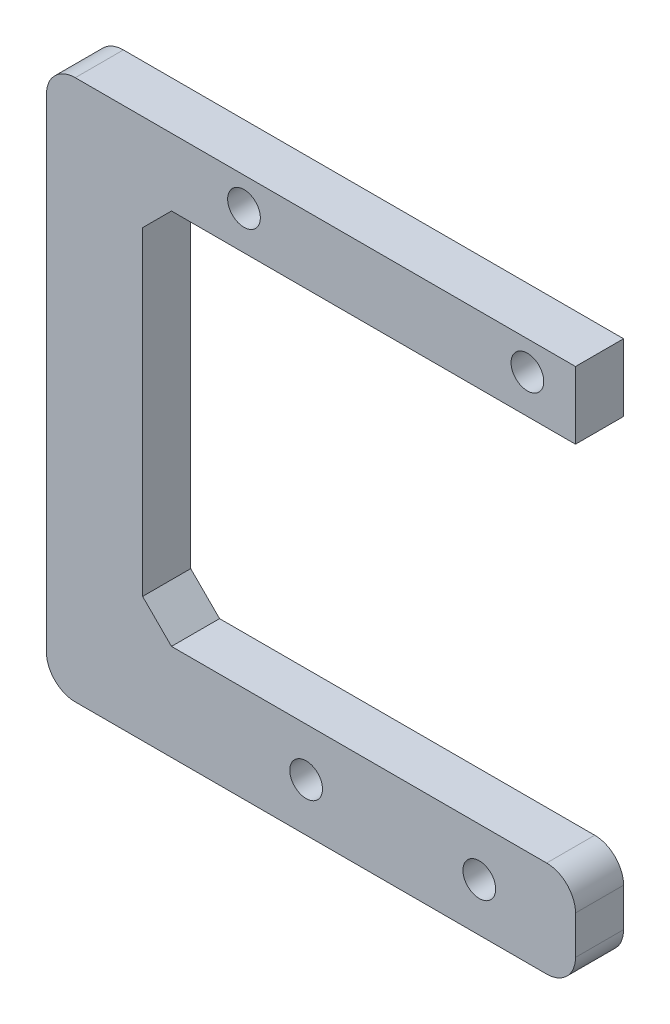
ISO-10303-21;
HEADER;
FILE_DESCRIPTION(('STEP AP214'),'2;1');
FILE_NAME('part.step','',(''),(''),'','','');
FILE_SCHEMA(('AUTOMOTIVE_DESIGN { 1 0 10303 214 1 1 1 1 }'));
ENDSEC;
DATA;
#1=APPLICATION_CONTEXT('core data for automotive mechanical design processes');
#2=APPLICATION_PROTOCOL_DEFINITION('international standard','automotive_design',2000,#1);
#3=PRODUCT_CONTEXT('',#1,'mechanical');
#4=PRODUCT('Part','Part','',(#3));
#5=PRODUCT_RELATED_PRODUCT_CATEGORY('part','',(#4));
#6=PRODUCT_DEFINITION_FORMATION('','',#4);
#7=PRODUCT_DEFINITION_CONTEXT('part definition',#1,'design');
#8=PRODUCT_DEFINITION('design','',#6,#7);
#9=PRODUCT_DEFINITION_SHAPE('','',#8);
#10=(LENGTH_UNIT() NAMED_UNIT(*) SI_UNIT(.MILLI.,.METRE.));
#11=(NAMED_UNIT(*) PLANE_ANGLE_UNIT() SI_UNIT($,.RADIAN.));
#12=(NAMED_UNIT(*) SI_UNIT($,.STERADIAN.) SOLID_ANGLE_UNIT());
#13=UNCERTAINTY_MEASURE_WITH_UNIT(LENGTH_MEASURE(1.E-05),#10,'distance_accuracy_value','');
#14=(GEOMETRIC_REPRESENTATION_CONTEXT(3) GLOBAL_UNCERTAINTY_ASSIGNED_CONTEXT((#13)) GLOBAL_UNIT_ASSIGNED_CONTEXT((#10,
#11,#12)) REPRESENTATION_CONTEXT('',''));
#15=CARTESIAN_POINT('',(0.,0.,0.));
#16=DIRECTION('',(0.,0.,1.));
#17=DIRECTION('',(1.,0.,0.));
#18=AXIS2_PLACEMENT_3D('',#15,#16,#17);
#19=CARTESIAN_POINT('',(0.,0.,5.));
#20=DIRECTION('',(0.,0.,-1.));
#21=DIRECTION('',(-1.,0.,0.));
#22=AXIS2_PLACEMENT_3D('',#19,#20,#21);
#23=PLANE('',#22);
#24=DIRECTION('',(-1.,0.,0.));
#25=VECTOR('',#24,1.);
#26=CARTESIAN_POINT('',(-55.,56.2,5.));
#27=LINE('',#26,#25);
#28=CARTESIAN_POINT('',(0.,56.2,5.));
#29=VERTEX_POINT('',#28);
#30=CARTESIAN_POINT('',(-52.,56.2,5.));
#31=VERTEX_POINT('',#30);
#32=EDGE_CURVE('E158',#29,#31,#27,.T.);
#33=ORIENTED_EDGE('',*,*,#32,.T.);
#34=CARTESIAN_POINT('',(-52.,53.2,5.));
#35=DIRECTION('',(0.,0.,-1.));
#36=DIRECTION('',(-1.,0.,0.));
#37=AXIS2_PLACEMENT_3D('',#34,#35,#36);
#38=CIRCLE('',#37,3.);
#39=CARTESIAN_POINT('',(-55.,53.2,5.));
#40=VERTEX_POINT('',#39);
#41=EDGE_CURVE('E213',#31,#40,#38,.F.);
#42=ORIENTED_EDGE('',*,*,#41,.T.);
#43=DIRECTION('',(0.,-1.,0.));
#44=VECTOR('',#43,1.);
#45=CARTESIAN_POINT('',(-55.,0.,5.));
#46=LINE('',#45,#44);
#47=CARTESIAN_POINT('',(-55.,2.99999999999999,5.));
#48=VERTEX_POINT('',#47);
#49=EDGE_CURVE('E160',#40,#48,#46,.T.);
#50=ORIENTED_EDGE('',*,*,#49,.T.);
#51=CARTESIAN_POINT('',(-52.,2.99999999999999,5.));
#52=DIRECTION('',(0.,0.,-1.));
#53=DIRECTION('',(-1.,0.,0.));
#54=AXIS2_PLACEMENT_3D('',#51,#52,#53);
#55=CIRCLE('',#54,3.);
#56=CARTESIAN_POINT('',(-52.,0.,5.));
#57=VERTEX_POINT('',#56);
#58=EDGE_CURVE('E211',#48,#57,#55,.F.);
#59=ORIENTED_EDGE('',*,*,#58,.T.);
#60=DIRECTION('',(1.,0.,0.));
#61=VECTOR('',#60,1.);
#62=CARTESIAN_POINT('',(0.,0.,5.));
#63=LINE('',#62,#61);
#64=CARTESIAN_POINT('',(-3.,0.,5.));
#65=VERTEX_POINT('',#64);
#66=EDGE_CURVE('E166',#57,#65,#63,.T.);
#67=ORIENTED_EDGE('',*,*,#66,.T.);
#68=CARTESIAN_POINT('',(-3.,3.,5.));
#69=DIRECTION('',(0.,0.,-1.));
#70=DIRECTION('',(-1.,0.,0.));
#71=AXIS2_PLACEMENT_3D('',#68,#69,#70);
#72=CIRCLE('',#71,3.);
#73=CARTESIAN_POINT('',(0.,3.,5.));
#74=VERTEX_POINT('',#73);
#75=EDGE_CURVE('E209',#65,#74,#72,.F.);
#76=ORIENTED_EDGE('',*,*,#75,.T.);
#77=DIRECTION('',(0.,1.,0.));
#78=VECTOR('',#77,1.);
#79=CARTESIAN_POINT('',(0.,9.99999999999999,5.));
#80=LINE('',#79,#78);
#81=CARTESIAN_POINT('',(0.,6.99999999999999,5.));
#82=VERTEX_POINT('',#81);
#83=EDGE_CURVE('E191',#74,#82,#80,.T.);
#84=ORIENTED_EDGE('',*,*,#83,.T.);
#85=CARTESIAN_POINT('',(-3.,6.99999999999999,5.));
#86=DIRECTION('',(0.,0.,-1.));
#87=DIRECTION('',(-1.,0.,0.));
#88=AXIS2_PLACEMENT_3D('',#85,#86,#87);
#89=CIRCLE('',#88,3.);
#90=CARTESIAN_POINT('',(-3.00000000000002,9.99999999999999,5.));
#91=VERTEX_POINT('',#90);
#92=EDGE_CURVE('E207',#82,#91,#89,.F.);
#93=ORIENTED_EDGE('',*,*,#92,.T.);
#94=DIRECTION('',(-1.,0.,0.));
#95=VECTOR('',#94,1.);
#96=CARTESIAN_POINT('',(-45.,9.99999999999999,5.));
#97=LINE('',#96,#95);
#98=CARTESIAN_POINT('',(-42.,9.99999999999999,5.));
#99=VERTEX_POINT('',#98);
#100=EDGE_CURVE('E321',#91,#99,#97,.T.);
#101=ORIENTED_EDGE('',*,*,#100,.T.);
#102=DIRECTION('',(0.707106781186544,-0.707106781186551,0.));
#103=VECTOR('',#102,1.);
#104=CARTESIAN_POINT('',(-16.0000000000002,-16.,5.));
#105=LINE('',#104,#103);
#106=CARTESIAN_POINT('',(-45.,13.,5.));
#107=VERTEX_POINT('',#106);
#108=EDGE_CURVE('E239',#99,#107,#105,.F.);
#109=ORIENTED_EDGE('',*,*,#108,.T.);
#110=DIRECTION('',(0.,1.,0.));
#111=VECTOR('',#110,1.);
#112=CARTESIAN_POINT('',(-45.,49.2,5.));
#113=LINE('',#112,#111);
#114=CARTESIAN_POINT('',(-45.,46.2,5.));
#115=VERTEX_POINT('',#114);
#116=EDGE_CURVE('E143',#107,#115,#113,.T.);
#117=ORIENTED_EDGE('',*,*,#116,.T.);
#118=DIRECTION('',(-0.707106781186551,-0.707106781186544,0.));
#119=VECTOR('',#118,1.);
#120=CARTESIAN_POINT('',(-45.5999999999998,45.6000000000002,5.));
#121=LINE('',#120,#119);
#122=CARTESIAN_POINT('',(-42.,49.2,5.));
#123=VERTEX_POINT('',#122);
#124=EDGE_CURVE('E11',#115,#123,#121,.F.);
#125=ORIENTED_EDGE('',*,*,#124,.T.);
#126=DIRECTION('',(1.,0.,0.));
#127=VECTOR('',#126,1.);
#128=CARTESIAN_POINT('',(0.,49.2,5.));
#129=LINE('',#128,#127);
#130=CARTESIAN_POINT('',(0.,49.2,5.));
#131=VERTEX_POINT('',#130);
#132=EDGE_CURVE('E135',#123,#131,#129,.T.);
#133=ORIENTED_EDGE('',*,*,#132,.T.);
#134=DIRECTION('',(0.,1.,0.));
#135=VECTOR('',#134,1.);
#136=CARTESIAN_POINT('',(0.,56.2,5.));
#137=LINE('',#136,#135);
#138=EDGE_CURVE('E140',#131,#29,#137,.T.);
#139=ORIENTED_EDGE('',*,*,#138,.T.);
#140=EDGE_LOOP('',(#33,#42,#50,#59,#67,#76,#84,#93,#101,#109,#117,#125,#133,#139));
#141=FACE_BOUND('',#140,.T.);
#142=CARTESIAN_POINT('',(-10.,4.99999999999999,5.));
#143=DIRECTION('',(0.,0.,1.));
#144=DIRECTION('',(1.,0.,0.));
#145=AXIS2_PLACEMENT_3D('',#142,#143,#144);
#146=CIRCLE('',#145,1.7);
#147=CARTESIAN_POINT('',(-8.3,4.99999999999999,5.));
#148=VERTEX_POINT('',#147);
#149=EDGE_CURVE('E173',#148,#148,#146,.T.);
#150=ORIENTED_EDGE('',*,*,#149,.F.);
#151=EDGE_LOOP('',(#150));
#152=FACE_BOUND('',#151,.T.);
#153=CARTESIAN_POINT('',(-28.,4.99999999999999,5.));
#154=DIRECTION('',(0.,0.,1.));
#155=DIRECTION('',(1.,0.,0.));
#156=AXIS2_PLACEMENT_3D('',#153,#154,#155);
#157=CIRCLE('',#156,1.7);
#158=CARTESIAN_POINT('',(-26.3,4.99999999999999,5.));
#159=VERTEX_POINT('',#158);
#160=EDGE_CURVE('E332',#159,#159,#157,.T.);
#161=ORIENTED_EDGE('',*,*,#160,.F.);
#162=EDGE_LOOP('',(#161));
#163=FACE_BOUND('',#162,.T.);
#164=CARTESIAN_POINT('',(-5.,53.2,5.));
#165=DIRECTION('',(0.,0.,1.));
#166=DIRECTION('',(1.,0.,0.));
#167=AXIS2_PLACEMENT_3D('',#164,#165,#166);
#168=CIRCLE('',#167,1.7);
#169=CARTESIAN_POINT('',(-3.3,53.2,5.));
#170=VERTEX_POINT('',#169);
#171=EDGE_CURVE('E338',#170,#170,#168,.T.);
#172=ORIENTED_EDGE('',*,*,#171,.F.);
#173=EDGE_LOOP('',(#172));
#174=FACE_BOUND('',#173,.T.);
#175=CARTESIAN_POINT('',(-34.46,53.2,5.));
#176=DIRECTION('',(0.,0.,1.));
#177=DIRECTION('',(1.,0.,0.));
#178=AXIS2_PLACEMENT_3D('',#175,#176,#177);
#179=CIRCLE('',#178,1.7);
#180=CARTESIAN_POINT('',(-32.76,53.2,5.));
#181=VERTEX_POINT('',#180);
#182=EDGE_CURVE('E344',#181,#181,#179,.T.);
#183=ORIENTED_EDGE('',*,*,#182,.F.);
#184=EDGE_LOOP('',(#183));
#185=FACE_BOUND('',#184,.T.);
#186=ADVANCED_FACE('F37',(#141,#152,#163,#174,#185),#23,.F.);
#187=CARTESIAN_POINT('',(0.,0.,0.));
#188=DIRECTION('',(0.,0.,-1.));
#189=DIRECTION('',(-1.,0.,0.));
#190=AXIS2_PLACEMENT_3D('',#187,#188,#189);
#191=PLANE('',#190);
#192=CARTESIAN_POINT('',(-5.,53.2,0.));
#193=DIRECTION('',(0.,0.,1.));
#194=DIRECTION('',(1.,0.,0.));
#195=AXIS2_PLACEMENT_3D('',#192,#193,#194);
#196=CIRCLE('',#195,1.7);
#197=CARTESIAN_POINT('',(-3.3,53.2,0.));
#198=VERTEX_POINT('',#197);
#199=EDGE_CURVE('E341',#198,#198,#196,.T.);
#200=ORIENTED_EDGE('',*,*,#199,.T.);
#201=EDGE_LOOP('',(#200));
#202=FACE_BOUND('',#201,.T.);
#203=CARTESIAN_POINT('',(-10.,4.99999999999999,0.));
#204=DIRECTION('',(0.,0.,1.));
#205=DIRECTION('',(1.,0.,0.));
#206=AXIS2_PLACEMENT_3D('',#203,#204,#205);
#207=CIRCLE('',#206,1.7);
#208=CARTESIAN_POINT('',(-8.3,4.99999999999999,0.));
#209=VERTEX_POINT('',#208);
#210=EDGE_CURVE('E329',#209,#209,#207,.T.);
#211=ORIENTED_EDGE('',*,*,#210,.T.);
#212=EDGE_LOOP('',(#211));
#213=FACE_BOUND('',#212,.T.);
#214=DIRECTION('',(0.,-1.,0.));
#215=VECTOR('',#214,1.);
#216=CARTESIAN_POINT('',(-55.,0.,0.));
#217=LINE('',#216,#215);
#218=CARTESIAN_POINT('',(-55.,53.2,0.));
#219=VERTEX_POINT('',#218);
#220=CARTESIAN_POINT('',(-55.,2.99999999999999,0.));
#221=VERTEX_POINT('',#220);
#222=EDGE_CURVE('E185',#219,#221,#217,.T.);
#223=ORIENTED_EDGE('',*,*,#222,.F.);
#224=CARTESIAN_POINT('',(-52.,53.2,0.));
#225=DIRECTION('',(0.,0.,-1.));
#226=DIRECTION('',(-1.,0.,0.));
#227=AXIS2_PLACEMENT_3D('',#224,#225,#226);
#228=CIRCLE('',#227,3.);
#229=CARTESIAN_POINT('',(-52.,56.2,0.));
#230=VERTEX_POINT('',#229);
#231=EDGE_CURVE('E203',#219,#230,#228,.T.);
#232=ORIENTED_EDGE('',*,*,#231,.T.);
#233=DIRECTION('',(-1.,0.,0.));
#234=VECTOR('',#233,1.);
#235=CARTESIAN_POINT('',(-55.,56.2,0.));
#236=LINE('',#235,#234);
#237=CARTESIAN_POINT('',(0.,56.2,0.));
#238=VERTEX_POINT('',#237);
#239=EDGE_CURVE('E182',#238,#230,#236,.T.);
#240=ORIENTED_EDGE('',*,*,#239,.F.);
#241=DIRECTION('',(0.,1.,0.));
#242=VECTOR('',#241,1.);
#243=CARTESIAN_POINT('',(0.,56.2,0.));
#244=LINE('',#243,#242);
#245=CARTESIAN_POINT('',(0.,49.2,0.));
#246=VERTEX_POINT('',#245);
#247=EDGE_CURVE('E180',#246,#238,#244,.T.);
#248=ORIENTED_EDGE('',*,*,#247,.F.);
#249=DIRECTION('',(1.,0.,0.));
#250=VECTOR('',#249,1.);
#251=CARTESIAN_POINT('',(0.,49.2,0.));
#252=LINE('',#251,#250);
#253=CARTESIAN_POINT('',(-42.,49.2,0.));
#254=VERTEX_POINT('',#253);
#255=EDGE_CURVE('E149',#254,#246,#252,.T.);
#256=ORIENTED_EDGE('',*,*,#255,.F.);
#257=DIRECTION('',(0.707106781186551,0.707106781186544,0.));
#258=VECTOR('',#257,1.);
#259=CARTESIAN_POINT('',(-42.,49.2,0.));
#260=LINE('',#259,#258);
#261=CARTESIAN_POINT('',(-45.,46.2,0.));
#262=VERTEX_POINT('',#261);
#263=EDGE_CURVE('E46',#254,#262,#260,.F.);
#264=ORIENTED_EDGE('',*,*,#263,.T.);
#265=DIRECTION('',(0.,1.,0.));
#266=VECTOR('',#265,1.);
#267=CARTESIAN_POINT('',(-45.,49.2,0.));
#268=LINE('',#267,#266);
#269=CARTESIAN_POINT('',(-45.,13.,0.));
#270=VERTEX_POINT('',#269);
#271=EDGE_CURVE('E176',#270,#262,#268,.T.);
#272=ORIENTED_EDGE('',*,*,#271,.F.);
#273=DIRECTION('',(-0.707106781186544,0.707106781186551,0.));
#274=VECTOR('',#273,1.);
#275=CARTESIAN_POINT('',(-45.,13.,0.));
#276=LINE('',#275,#274);
#277=CARTESIAN_POINT('',(-42.,9.99999999999999,0.));
#278=VERTEX_POINT('',#277);
#279=EDGE_CURVE('E237',#270,#278,#276,.F.);
#280=ORIENTED_EDGE('',*,*,#279,.T.);
#281=DIRECTION('',(-1.,0.,0.));
#282=VECTOR('',#281,1.);
#283=CARTESIAN_POINT('',(-45.,9.99999999999999,0.));
#284=LINE('',#283,#282);
#285=CARTESIAN_POINT('',(-3.00000000000002,9.99999999999999,0.));
#286=VERTEX_POINT('',#285);
#287=EDGE_CURVE('E172',#286,#278,#284,.T.);
#288=ORIENTED_EDGE('',*,*,#287,.F.);
#289=CARTESIAN_POINT('',(-3.,6.99999999999999,0.));
#290=DIRECTION('',(0.,0.,-1.));
#291=DIRECTION('',(-1.,0.,0.));
#292=AXIS2_PLACEMENT_3D('',#289,#290,#291);
#293=CIRCLE('',#292,3.);
#294=CARTESIAN_POINT('',(0.,6.99999999999999,0.));
#295=VERTEX_POINT('',#294);
#296=EDGE_CURVE('E197',#286,#295,#293,.T.);
#297=ORIENTED_EDGE('',*,*,#296,.T.);
#298=DIRECTION('',(0.,1.,0.));
#299=VECTOR('',#298,1.);
#300=CARTESIAN_POINT('',(0.,9.99999999999999,0.));
#301=LINE('',#300,#299);
#302=CARTESIAN_POINT('',(0.,3.,0.));
#303=VERTEX_POINT('',#302);
#304=EDGE_CURVE('E169',#303,#295,#301,.T.);
#305=ORIENTED_EDGE('',*,*,#304,.F.);
#306=CARTESIAN_POINT('',(-3.,3.,0.));
#307=DIRECTION('',(0.,0.,-1.));
#308=DIRECTION('',(-1.,0.,0.));
#309=AXIS2_PLACEMENT_3D('',#306,#307,#308);
#310=CIRCLE('',#309,3.);
#311=CARTESIAN_POINT('',(-3.,0.,0.));
#312=VERTEX_POINT('',#311);
#313=EDGE_CURVE('E199',#303,#312,#310,.T.);
#314=ORIENTED_EDGE('',*,*,#313,.T.);
#315=DIRECTION('',(1.,0.,0.));
#316=VECTOR('',#315,1.);
#317=CARTESIAN_POINT('',(0.,0.,0.));
#318=LINE('',#317,#316);
#319=CARTESIAN_POINT('',(-52.,0.,0.));
#320=VERTEX_POINT('',#319);
#321=EDGE_CURVE('E188',#320,#312,#318,.T.);
#322=ORIENTED_EDGE('',*,*,#321,.F.);
#323=CARTESIAN_POINT('',(-52.,2.99999999999999,0.));
#324=DIRECTION('',(0.,0.,-1.));
#325=DIRECTION('',(-1.,0.,0.));
#326=AXIS2_PLACEMENT_3D('',#323,#324,#325);
#327=CIRCLE('',#326,3.);
#328=EDGE_CURVE('E201',#320,#221,#327,.T.);
#329=ORIENTED_EDGE('',*,*,#328,.T.);
#330=EDGE_LOOP('',(#223,#232,#240,#248,#256,#264,#272,#280,#288,#297,#305,#314,#322,#329));
#331=FACE_BOUND('',#330,.T.);
#332=CARTESIAN_POINT('',(-28.,4.99999999999999,0.));
#333=DIRECTION('',(0.,0.,1.));
#334=DIRECTION('',(1.,0.,0.));
#335=AXIS2_PLACEMENT_3D('',#332,#333,#334);
#336=CIRCLE('',#335,1.7);
#337=CARTESIAN_POINT('',(-26.3,4.99999999999999,0.));
#338=VERTEX_POINT('',#337);
#339=EDGE_CURVE('E335',#338,#338,#336,.T.);
#340=ORIENTED_EDGE('',*,*,#339,.T.);
#341=EDGE_LOOP('',(#340));
#342=FACE_BOUND('',#341,.T.);
#343=CARTESIAN_POINT('',(-34.46,53.2,0.));
#344=DIRECTION('',(0.,0.,1.));
#345=DIRECTION('',(1.,0.,0.));
#346=AXIS2_PLACEMENT_3D('',#343,#344,#345);
#347=CIRCLE('',#346,1.7);
#348=CARTESIAN_POINT('',(-32.76,53.2,0.));
#349=VERTEX_POINT('',#348);
#350=EDGE_CURVE('E347',#349,#349,#347,.T.);
#351=ORIENTED_EDGE('',*,*,#350,.T.);
#352=EDGE_LOOP('',(#351));
#353=FACE_BOUND('',#352,.T.);
#354=ADVANCED_FACE('F243',(#202,#213,#331,#342,#353),#191,.T.);
#355=CARTESIAN_POINT('',(0.,9.99999999999999,5.));
#356=DIRECTION('',(-1.,0.,0.));
#357=DIRECTION('',(0.,0.,1.));
#358=AXIS2_PLACEMENT_3D('',#355,#356,#357);
#359=PLANE('',#358);
#360=ORIENTED_EDGE('',*,*,#83,.F.);
#361=DIRECTION('',(0.,0.,-1.));
#362=VECTOR('',#361,1.);
#363=CARTESIAN_POINT('',(0.,3.,5.));
#364=LINE('',#363,#362);
#365=EDGE_CURVE('E222',#74,#303,#364,.T.);
#366=ORIENTED_EDGE('',*,*,#365,.T.);
#367=ORIENTED_EDGE('',*,*,#304,.T.);
#368=DIRECTION('',(0.,0.,-1.));
#369=VECTOR('',#368,1.);
#370=CARTESIAN_POINT('',(0.,6.99999999999999,5.));
#371=LINE('',#370,#369);
#372=EDGE_CURVE('E220',#295,#82,#371,.F.);
#373=ORIENTED_EDGE('',*,*,#372,.T.);
#374=EDGE_LOOP('',(#360,#366,#367,#373));
#375=FACE_BOUND('',#374,.T.);
#376=ADVANCED_FACE('F261',(#375),#359,.F.);
#377=CARTESIAN_POINT('',(-45.,9.99999999999999,5.));
#378=DIRECTION('',(0.,-1.,0.));
#379=DIRECTION('',(0.,0.,-1.));
#380=AXIS2_PLACEMENT_3D('',#377,#378,#379);
#381=PLANE('',#380);
#382=ORIENTED_EDGE('',*,*,#287,.T.);
#383=DIRECTION('',(0.,0.,1.));
#384=VECTOR('',#383,1.);
#385=CARTESIAN_POINT('',(-42.,9.99999999999999,5.));
#386=LINE('',#385,#384);
#387=EDGE_CURVE('E233',#278,#99,#386,.T.);
#388=ORIENTED_EDGE('',*,*,#387,.T.);
#389=ORIENTED_EDGE('',*,*,#100,.F.);
#390=DIRECTION('',(0.,0.,-1.));
#391=VECTOR('',#390,1.);
#392=CARTESIAN_POINT('',(-3.,9.99999999999999,5.));
#393=LINE('',#392,#391);
#394=EDGE_CURVE('E225',#91,#286,#393,.T.);
#395=ORIENTED_EDGE('',*,*,#394,.T.);
#396=EDGE_LOOP('',(#382,#388,#389,#395));
#397=FACE_BOUND('',#396,.T.);
#398=ADVANCED_FACE('F286',(#397),#381,.F.);
#399=CARTESIAN_POINT('',(-45.,49.2,5.));
#400=DIRECTION('',(-1.,0.,0.));
#401=DIRECTION('',(0.,-1.,0.));
#402=AXIS2_PLACEMENT_3D('',#399,#400,#401);
#403=PLANE('',#402);
#404=ORIENTED_EDGE('',*,*,#116,.F.);
#405=DIRECTION('',(0.,0.,-1.));
#406=VECTOR('',#405,1.);
#407=CARTESIAN_POINT('',(-45.,13.,0.));
#408=LINE('',#407,#406);
#409=EDGE_CURVE('E230',#107,#270,#408,.T.);
#410=ORIENTED_EDGE('',*,*,#409,.T.);
#411=ORIENTED_EDGE('',*,*,#271,.T.);
#412=DIRECTION('',(0.,0.,1.));
#413=VECTOR('',#412,1.);
#414=CARTESIAN_POINT('',(-45.,46.2,5.));
#415=LINE('',#414,#413);
#416=EDGE_CURVE('E228',#262,#115,#415,.T.);
#417=ORIENTED_EDGE('',*,*,#416,.T.);
#418=EDGE_LOOP('',(#404,#410,#411,#417));
#419=FACE_BOUND('',#418,.T.);
#420=ADVANCED_FACE('F247',(#419),#403,.F.);
#421=CARTESIAN_POINT('',(0.,49.2,5.));
#422=DIRECTION('',(0.,1.,0.));
#423=DIRECTION('',(-1.,0.,0.));
#424=AXIS2_PLACEMENT_3D('',#421,#422,#423);
#425=PLANE('',#424);
#426=ORIENTED_EDGE('',*,*,#132,.F.);
#427=DIRECTION('',(0.,0.,-1.));
#428=VECTOR('',#427,1.);
#429=CARTESIAN_POINT('',(-42.,49.2,0.));
#430=LINE('',#429,#428);
#431=EDGE_CURVE('E235',#123,#254,#430,.T.);
#432=ORIENTED_EDGE('',*,*,#431,.T.);
#433=ORIENTED_EDGE('',*,*,#255,.T.);
#434=DIRECTION('',(0.,0.,-1.));
#435=VECTOR('',#434,1.);
#436=CARTESIAN_POINT('',(0.,49.2,5.));
#437=LINE('',#436,#435);
#438=EDGE_CURVE('E146',#131,#246,#437,.T.);
#439=ORIENTED_EDGE('',*,*,#438,.F.);
#440=EDGE_LOOP('',(#426,#432,#433,#439));
#441=FACE_BOUND('',#440,.T.);
#442=ADVANCED_FACE('F147',(#441),#425,.F.);
#443=CARTESIAN_POINT('',(0.,56.2,5.));
#444=DIRECTION('',(-1.,0.,0.));
#445=DIRECTION('',(0.,-1.,0.));
#446=AXIS2_PLACEMENT_3D('',#443,#444,#445);
#447=PLANE('',#446);
#448=ORIENTED_EDGE('',*,*,#247,.T.);
#449=DIRECTION('',(0.,0.,-1.));
#450=VECTOR('',#449,1.);
#451=CARTESIAN_POINT('',(0.,56.2,5.));
#452=LINE('',#451,#450);
#453=EDGE_CURVE('E153',#29,#238,#452,.T.);
#454=ORIENTED_EDGE('',*,*,#453,.F.);
#455=ORIENTED_EDGE('',*,*,#138,.F.);
#456=ORIENTED_EDGE('',*,*,#438,.T.);
#457=EDGE_LOOP('',(#448,#454,#455,#456));
#458=FACE_BOUND('',#457,.T.);
#459=ADVANCED_FACE('F155',(#458),#447,.F.);
#460=CARTESIAN_POINT('',(-55.,56.2,5.));
#461=DIRECTION('',(0.,-1.,0.));
#462=DIRECTION('',(0.,0.,-1.));
#463=AXIS2_PLACEMENT_3D('',#460,#461,#462);
#464=PLANE('',#463);
#465=ORIENTED_EDGE('',*,*,#239,.T.);
#466=DIRECTION('',(0.,0.,-1.));
#467=VECTOR('',#466,1.);
#468=CARTESIAN_POINT('',(-52.,56.2,5.));
#469=LINE('',#468,#467);
#470=EDGE_CURVE('E205',#230,#31,#469,.F.);
#471=ORIENTED_EDGE('',*,*,#470,.T.);
#472=ORIENTED_EDGE('',*,*,#32,.F.);
#473=ORIENTED_EDGE('',*,*,#453,.T.);
#474=EDGE_LOOP('',(#465,#471,#472,#473));
#475=FACE_BOUND('',#474,.T.);
#476=ADVANCED_FACE('F275',(#475),#464,.F.);
#477=CARTESIAN_POINT('',(-55.,0.,5.));
#478=DIRECTION('',(1.,0.,0.));
#479=DIRECTION('',(0.,0.,-1.));
#480=AXIS2_PLACEMENT_3D('',#477,#478,#479);
#481=PLANE('',#480);
#482=ORIENTED_EDGE('',*,*,#49,.F.);
#483=DIRECTION('',(0.,0.,-1.));
#484=VECTOR('',#483,1.);
#485=CARTESIAN_POINT('',(-55.,53.2,5.));
#486=LINE('',#485,#484);
#487=EDGE_CURVE('E194',#40,#219,#486,.T.);
#488=ORIENTED_EDGE('',*,*,#487,.T.);
#489=ORIENTED_EDGE('',*,*,#222,.T.);
#490=DIRECTION('',(0.,0.,-1.));
#491=VECTOR('',#490,1.);
#492=CARTESIAN_POINT('',(-55.,2.99999999999999,5.));
#493=LINE('',#492,#491);
#494=EDGE_CURVE('E152',#221,#48,#493,.F.);
#495=ORIENTED_EDGE('',*,*,#494,.T.);
#496=EDGE_LOOP('',(#482,#488,#489,#495));
#497=FACE_BOUND('',#496,.T.);
#498=ADVANCED_FACE('F271',(#497),#481,.F.);
#499=CARTESIAN_POINT('',(0.,0.,5.));
#500=DIRECTION('',(0.,1.,0.));
#501=DIRECTION('',(-1.,0.,0.));
#502=AXIS2_PLACEMENT_3D('',#499,#500,#501);
#503=PLANE('',#502);
#504=ORIENTED_EDGE('',*,*,#66,.F.);
#505=DIRECTION('',(0.,0.,-1.));
#506=VECTOR('',#505,1.);
#507=CARTESIAN_POINT('',(-52.,0.,5.));
#508=LINE('',#507,#506);
#509=EDGE_CURVE('E217',#57,#320,#508,.T.);
#510=ORIENTED_EDGE('',*,*,#509,.T.);
#511=ORIENTED_EDGE('',*,*,#321,.T.);
#512=DIRECTION('',(0.,0.,-1.));
#513=VECTOR('',#512,1.);
#514=CARTESIAN_POINT('',(-3.,0.,5.));
#515=LINE('',#514,#513);
#516=EDGE_CURVE('E215',#312,#65,#515,.F.);
#517=ORIENTED_EDGE('',*,*,#516,.T.);
#518=EDGE_LOOP('',(#504,#510,#511,#517));
#519=FACE_BOUND('',#518,.T.);
#520=ADVANCED_FACE('F268',(#519),#503,.F.);
#521=CARTESIAN_POINT('',(-10.,4.99999999999999,5.));
#522=DIRECTION('',(0.,0.,-1.));
#523=DIRECTION('',(-1.,0.,0.));
#524=AXIS2_PLACEMENT_3D('',#521,#522,#523);
#525=CYLINDRICAL_SURFACE('',#524,1.7);
#526=ORIENTED_EDGE('',*,*,#149,.T.);
#527=EDGE_LOOP('',(#526));
#528=FACE_BOUND('',#527,.T.);
#529=ORIENTED_EDGE('',*,*,#210,.F.);
#530=EDGE_LOOP('',(#529));
#531=FACE_BOUND('',#530,.T.);
#532=ADVANCED_FACE('F265',(#528,#531),#525,.F.);
#533=CARTESIAN_POINT('',(-28.,4.99999999999999,5.));
#534=DIRECTION('',(0.,0.,-1.));
#535=DIRECTION('',(-1.,0.,0.));
#536=AXIS2_PLACEMENT_3D('',#533,#534,#535);
#537=CYLINDRICAL_SURFACE('',#536,1.7);
#538=ORIENTED_EDGE('',*,*,#160,.T.);
#539=EDGE_LOOP('',(#538));
#540=FACE_BOUND('',#539,.T.);
#541=ORIENTED_EDGE('',*,*,#339,.F.);
#542=EDGE_LOOP('',(#541));
#543=FACE_BOUND('',#542,.T.);
#544=ADVANCED_FACE('F363',(#540,#543),#537,.F.);
#545=CARTESIAN_POINT('',(-5.,53.2,5.));
#546=DIRECTION('',(0.,0.,-1.));
#547=DIRECTION('',(-1.,0.,0.));
#548=AXIS2_PLACEMENT_3D('',#545,#546,#547);
#549=CYLINDRICAL_SURFACE('',#548,1.7);
#550=ORIENTED_EDGE('',*,*,#171,.T.);
#551=EDGE_LOOP('',(#550));
#552=FACE_BOUND('',#551,.T.);
#553=ORIENTED_EDGE('',*,*,#199,.F.);
#554=EDGE_LOOP('',(#553));
#555=FACE_BOUND('',#554,.T.);
#556=ADVANCED_FACE('F356',(#552,#555),#549,.F.);
#557=CARTESIAN_POINT('',(-34.46,53.2,5.));
#558=DIRECTION('',(0.,0.,-1.));
#559=DIRECTION('',(-1.,0.,0.));
#560=AXIS2_PLACEMENT_3D('',#557,#558,#559);
#561=CYLINDRICAL_SURFACE('',#560,1.7);
#562=ORIENTED_EDGE('',*,*,#182,.T.);
#563=EDGE_LOOP('',(#562));
#564=FACE_BOUND('',#563,.T.);
#565=ORIENTED_EDGE('',*,*,#350,.F.);
#566=EDGE_LOOP('',(#565));
#567=FACE_BOUND('',#566,.T.);
#568=ADVANCED_FACE('F297',(#564,#567),#561,.F.);
#569=CARTESIAN_POINT('',(-52.,53.2,5.));
#570=DIRECTION('',(0.,0.,-1.));
#571=DIRECTION('',(-1.,0.,0.));
#572=AXIS2_PLACEMENT_3D('',#569,#570,#571);
#573=CYLINDRICAL_SURFACE('',#572,3.);
#574=ORIENTED_EDGE('',*,*,#41,.F.);
#575=ORIENTED_EDGE('',*,*,#470,.F.);
#576=ORIENTED_EDGE('',*,*,#231,.F.);
#577=ORIENTED_EDGE('',*,*,#487,.F.);
#578=EDGE_LOOP('',(#574,#575,#576,#577));
#579=FACE_BOUND('',#578,.T.);
#580=ADVANCED_FACE('F293',(#579),#573,.T.);
#581=CARTESIAN_POINT('',(-52.,2.99999999999999,5.));
#582=DIRECTION('',(0.,0.,-1.));
#583=DIRECTION('',(-1.,0.,0.));
#584=AXIS2_PLACEMENT_3D('',#581,#582,#583);
#585=CYLINDRICAL_SURFACE('',#584,3.);
#586=ORIENTED_EDGE('',*,*,#58,.F.);
#587=ORIENTED_EDGE('',*,*,#494,.F.);
#588=ORIENTED_EDGE('',*,*,#328,.F.);
#589=ORIENTED_EDGE('',*,*,#509,.F.);
#590=EDGE_LOOP('',(#586,#587,#588,#589));
#591=FACE_BOUND('',#590,.T.);
#592=ADVANCED_FACE('F296',(#591),#585,.T.);
#593=CARTESIAN_POINT('',(-3.,3.,5.));
#594=DIRECTION('',(0.,0.,-1.));
#595=DIRECTION('',(-1.,0.,0.));
#596=AXIS2_PLACEMENT_3D('',#593,#594,#595);
#597=CYLINDRICAL_SURFACE('',#596,3.);
#598=ORIENTED_EDGE('',*,*,#75,.F.);
#599=ORIENTED_EDGE('',*,*,#516,.F.);
#600=ORIENTED_EDGE('',*,*,#313,.F.);
#601=ORIENTED_EDGE('',*,*,#365,.F.);
#602=EDGE_LOOP('',(#598,#599,#600,#601));
#603=FACE_BOUND('',#602,.T.);
#604=ADVANCED_FACE('F301',(#603),#597,.T.);
#605=CARTESIAN_POINT('',(-3.,6.99999999999999,5.));
#606=DIRECTION('',(0.,0.,-1.));
#607=DIRECTION('',(-1.,0.,0.));
#608=AXIS2_PLACEMENT_3D('',#605,#606,#607);
#609=CYLINDRICAL_SURFACE('',#608,3.);
#610=ORIENTED_EDGE('',*,*,#92,.F.);
#611=ORIENTED_EDGE('',*,*,#372,.F.);
#612=ORIENTED_EDGE('',*,*,#296,.F.);
#613=ORIENTED_EDGE('',*,*,#394,.F.);
#614=EDGE_LOOP('',(#610,#611,#612,#613));
#615=FACE_BOUND('',#614,.T.);
#616=ADVANCED_FACE('F254',(#615),#609,.T.);
#617=CARTESIAN_POINT('',(-45.,13.,5.));
#618=DIRECTION('',(0.707106781186551,0.707106781186544,0.));
#619=DIRECTION('',(0.,0.,1.));
#620=AXIS2_PLACEMENT_3D('',#617,#618,#619);
#621=PLANE('',#620);
#622=ORIENTED_EDGE('',*,*,#108,.F.);
#623=ORIENTED_EDGE('',*,*,#387,.F.);
#624=ORIENTED_EDGE('',*,*,#279,.F.);
#625=ORIENTED_EDGE('',*,*,#409,.F.);
#626=EDGE_LOOP('',(#622,#623,#624,#625));
#627=FACE_BOUND('',#626,.T.);
#628=ADVANCED_FACE('F250',(#627),#621,.T.);
#629=CARTESIAN_POINT('',(-42.,49.2,5.));
#630=DIRECTION('',(0.707106781186544,-0.707106781186551,0.));
#631=DIRECTION('',(0.,0.,1.));
#632=AXIS2_PLACEMENT_3D('',#629,#630,#631);
#633=PLANE('',#632);
#634=ORIENTED_EDGE('',*,*,#124,.F.);
#635=ORIENTED_EDGE('',*,*,#416,.F.);
#636=ORIENTED_EDGE('',*,*,#263,.F.);
#637=ORIENTED_EDGE('',*,*,#431,.F.);
#638=EDGE_LOOP('',(#634,#635,#636,#637));
#639=FACE_BOUND('',#638,.T.);
#640=ADVANCED_FACE('F40',(#639),#633,.T.);
#641=CLOSED_SHELL('',(#186,#354,#376,#398,#420,#442,#459,#476,#498,#520,#532,#544,#556,#568,
#580,#592,#604,#616,#628,#640));
#642=MANIFOLD_SOLID_BREP('B2',#641);
#643=ADVANCED_BREP_SHAPE_REPRESENTATION('',(#18,#642),#14);
#644=SHAPE_DEFINITION_REPRESENTATION(#9,#643);
ENDSEC;
END-ISO-10303-21;
